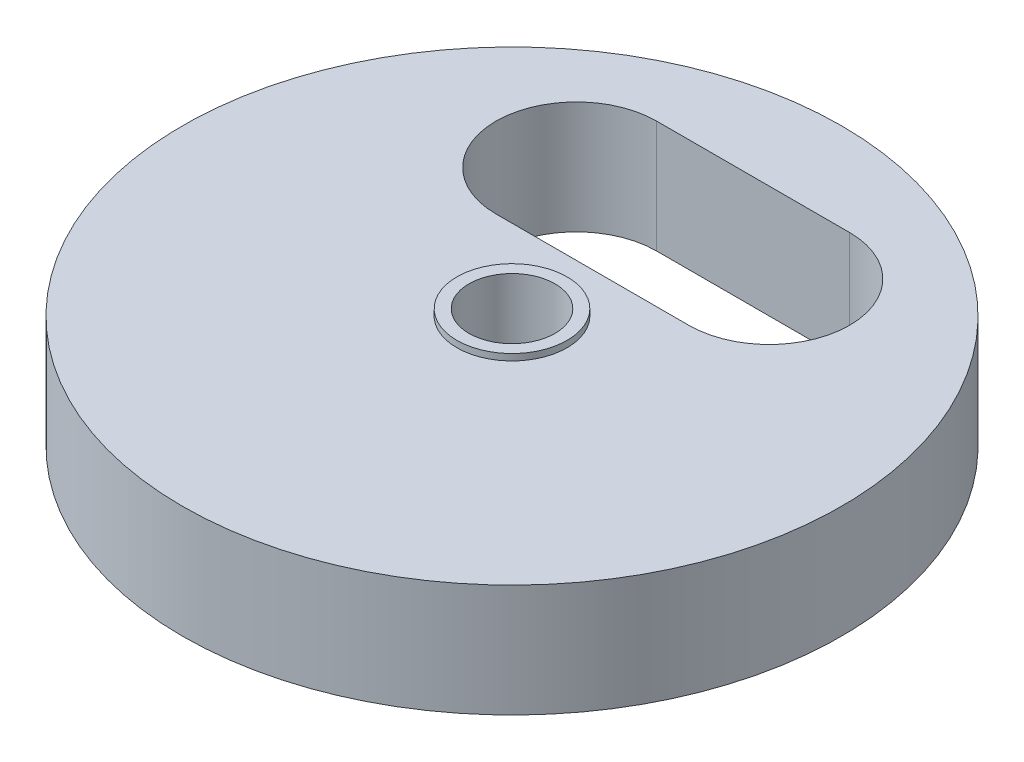
ISO-10303-21;
HEADER;
FILE_DESCRIPTION(('STEP AP214'),'2;1');
FILE_NAME('part.step','',(''),(''),'','','');
FILE_SCHEMA(('AUTOMOTIVE_DESIGN { 1 0 10303 214 1 1 1 1 }'));
ENDSEC;
DATA;
#1=APPLICATION_CONTEXT('core data for automotive mechanical design processes');
#2=APPLICATION_PROTOCOL_DEFINITION('international standard','automotive_design',2000,#1);
#3=PRODUCT_CONTEXT('',#1,'mechanical');
#4=PRODUCT('Part','Part','',(#3));
#5=PRODUCT_RELATED_PRODUCT_CATEGORY('part','',(#4));
#6=PRODUCT_DEFINITION_FORMATION('','',#4);
#7=PRODUCT_DEFINITION_CONTEXT('part definition',#1,'design');
#8=PRODUCT_DEFINITION('design','',#6,#7);
#9=PRODUCT_DEFINITION_SHAPE('','',#8);
#10=(LENGTH_UNIT() NAMED_UNIT(*) SI_UNIT(.MILLI.,.METRE.));
#11=(NAMED_UNIT(*) PLANE_ANGLE_UNIT() SI_UNIT($,.RADIAN.));
#12=(NAMED_UNIT(*) SI_UNIT($,.STERADIAN.) SOLID_ANGLE_UNIT());
#13=UNCERTAINTY_MEASURE_WITH_UNIT(LENGTH_MEASURE(1.E-05),#10,'distance_accuracy_value','');
#14=(GEOMETRIC_REPRESENTATION_CONTEXT(3) GLOBAL_UNCERTAINTY_ASSIGNED_CONTEXT((#13)) GLOBAL_UNIT_ASSIGNED_CONTEXT((#10,
#11,#12)) REPRESENTATION_CONTEXT('',''));
#15=CARTESIAN_POINT('',(0.,0.,0.));
#16=DIRECTION('',(0.,0.,1.));
#17=DIRECTION('',(1.,0.,0.));
#18=AXIS2_PLACEMENT_3D('',#15,#16,#17);
#19=CARTESIAN_POINT('',(0.,7.,0.));
#20=DIRECTION('',(0.,1.,0.));
#21=DIRECTION('',(0.,0.,1.));
#22=AXIS2_PLACEMENT_3D('',#19,#20,#21);
#23=PLANE('',#22);
#24=CARTESIAN_POINT('',(-6.,7.,-10.));
#25=DIRECTION('',(0.,1.,0.));
#26=DIRECTION('',(0.,0.,1.));
#27=AXIS2_PLACEMENT_3D('',#24,#25,#26);
#28=CIRCLE('',#27,5.);
#29=CARTESIAN_POINT('',(-6.,7.,-15.));
#30=VERTEX_POINT('',#29);
#31=CARTESIAN_POINT('',(-6.,7.,-5.));
#32=VERTEX_POINT('',#31);
#33=EDGE_CURVE('E55',#30,#32,#28,.T.);
#34=ORIENTED_EDGE('',*,*,#33,.F.);
#35=DIRECTION('',(-1.,0.,0.));
#36=VECTOR('',#35,1.);
#37=CARTESIAN_POINT('',(-6.,7.,-15.));
#38=LINE('',#37,#36);
#39=CARTESIAN_POINT('',(6.,7.,-15.));
#40=VERTEX_POINT('',#39);
#41=EDGE_CURVE('E102',#40,#30,#38,.T.);
#42=ORIENTED_EDGE('',*,*,#41,.F.);
#43=CARTESIAN_POINT('',(6.,7.,-10.));
#44=DIRECTION('',(0.,1.,0.));
#45=DIRECTION('',(0.,0.,1.));
#46=AXIS2_PLACEMENT_3D('',#43,#44,#45);
#47=CIRCLE('',#46,5.);
#48=CARTESIAN_POINT('',(6.,7.,-5.));
#49=VERTEX_POINT('',#48);
#50=EDGE_CURVE('E106',#49,#40,#47,.T.);
#51=ORIENTED_EDGE('',*,*,#50,.F.);
#52=DIRECTION('',(1.,0.,0.));
#53=VECTOR('',#52,1.);
#54=CARTESIAN_POINT('',(-6.,7.,-5.));
#55=LINE('',#54,#53);
#56=EDGE_CURVE('E115',#32,#49,#55,.T.);
#57=ORIENTED_EDGE('',*,*,#56,.F.);
#58=EDGE_LOOP('',(#34,#42,#51,#57));
#59=FACE_BOUND('',#58,.T.);
#60=CARTESIAN_POINT('',(0.,7.,0.));
#61=DIRECTION('',(0.,1.,0.));
#62=DIRECTION('',(0.,0.,1.));
#63=AXIS2_PLACEMENT_3D('',#60,#61,#62);
#64=CIRCLE('',#63,20.5);
#65=CARTESIAN_POINT('',(0.,7.,20.5));
#66=VERTEX_POINT('',#65);
#67=EDGE_CURVE('E11',#66,#66,#64,.T.);
#68=ORIENTED_EDGE('',*,*,#67,.T.);
#69=EDGE_LOOP('',(#68));
#70=FACE_BOUND('',#69,.T.);
#71=CARTESIAN_POINT('',(0.,7.,0.));
#72=DIRECTION('',(0.,1.,0.));
#73=DIRECTION('',(0.,0.,1.));
#74=AXIS2_PLACEMENT_3D('',#71,#72,#73);
#75=CIRCLE('',#74,3.425);
#76=CARTESIAN_POINT('',(0.,7.,3.425));
#77=VERTEX_POINT('',#76);
#78=EDGE_CURVE('E133',#77,#77,#75,.T.);
#79=ORIENTED_EDGE('',*,*,#78,.F.);
#80=EDGE_LOOP('',(#79));
#81=FACE_BOUND('',#80,.T.);
#82=ADVANCED_FACE('F39',(#59,#70,#81),#23,.T.);
#83=CARTESIAN_POINT('',(0.,7.,0.));
#84=DIRECTION('',(0.,-1.,0.));
#85=DIRECTION('',(0.,0.,-1.));
#86=AXIS2_PLACEMENT_3D('',#83,#84,#85);
#87=CYLINDRICAL_SURFACE('',#86,20.5);
#88=ORIENTED_EDGE('',*,*,#67,.F.);
#89=EDGE_LOOP('',(#88));
#90=FACE_BOUND('',#89,.T.);
#91=CARTESIAN_POINT('',(0.,0.,0.));
#92=DIRECTION('',(0.,1.,0.));
#93=DIRECTION('',(0.,0.,1.));
#94=AXIS2_PLACEMENT_3D('',#91,#92,#93);
#95=CIRCLE('',#94,20.5);
#96=CARTESIAN_POINT('',(0.,0.,20.5));
#97=VERTEX_POINT('',#96);
#98=EDGE_CURVE('E43',#97,#97,#95,.T.);
#99=ORIENTED_EDGE('',*,*,#98,.T.);
#100=EDGE_LOOP('',(#99));
#101=FACE_BOUND('',#100,.T.);
#102=ADVANCED_FACE('F41',(#90,#101),#87,.T.);
#103=CARTESIAN_POINT('',(0.,0.,0.));
#104=DIRECTION('',(0.,1.,0.));
#105=DIRECTION('',(0.,0.,1.));
#106=AXIS2_PLACEMENT_3D('',#103,#104,#105);
#107=PLANE('',#106);
#108=DIRECTION('',(-1.,0.,0.));
#109=VECTOR('',#108,1.);
#110=CARTESIAN_POINT('',(-6.,0.,-15.));
#111=LINE('',#110,#109);
#112=CARTESIAN_POINT('',(6.,0.,-15.));
#113=VERTEX_POINT('',#112);
#114=CARTESIAN_POINT('',(-6.,0.,-15.));
#115=VERTEX_POINT('',#114);
#116=EDGE_CURVE('E90',#113,#115,#111,.T.);
#117=ORIENTED_EDGE('',*,*,#116,.T.);
#118=CARTESIAN_POINT('',(-6.,0.,-10.));
#119=DIRECTION('',(0.,1.,0.));
#120=DIRECTION('',(0.,0.,1.));
#121=AXIS2_PLACEMENT_3D('',#118,#119,#120);
#122=CIRCLE('',#121,5.);
#123=CARTESIAN_POINT('',(-6.,0.,-5.));
#124=VERTEX_POINT('',#123);
#125=EDGE_CURVE('E83',#115,#124,#122,.T.);
#126=ORIENTED_EDGE('',*,*,#125,.T.);
#127=DIRECTION('',(1.,0.,0.));
#128=VECTOR('',#127,1.);
#129=CARTESIAN_POINT('',(-6.,0.,-5.));
#130=LINE('',#129,#128);
#131=CARTESIAN_POINT('',(6.,0.,-5.));
#132=VERTEX_POINT('',#131);
#133=EDGE_CURVE('E93',#124,#132,#130,.T.);
#134=ORIENTED_EDGE('',*,*,#133,.T.);
#135=CARTESIAN_POINT('',(6.,0.,-10.));
#136=DIRECTION('',(0.,1.,0.));
#137=DIRECTION('',(0.,0.,1.));
#138=AXIS2_PLACEMENT_3D('',#135,#136,#137);
#139=CIRCLE('',#138,5.);
#140=EDGE_CURVE('E63',#132,#113,#139,.T.);
#141=ORIENTED_EDGE('',*,*,#140,.T.);
#142=EDGE_LOOP('',(#117,#126,#134,#141));
#143=FACE_BOUND('',#142,.T.);
#144=CARTESIAN_POINT('',(0.,0.,0.));
#145=DIRECTION('',(0.,1.,0.));
#146=DIRECTION('',(0.,0.,1.));
#147=AXIS2_PLACEMENT_3D('',#144,#145,#146);
#148=CIRCLE('',#147,2.675);
#149=CARTESIAN_POINT('',(0.,0.,2.675));
#150=VERTEX_POINT('',#149);
#151=EDGE_CURVE('E138',#150,#150,#148,.T.);
#152=ORIENTED_EDGE('',*,*,#151,.T.);
#153=EDGE_LOOP('',(#152));
#154=FACE_BOUND('',#153,.T.);
#155=ORIENTED_EDGE('',*,*,#98,.F.);
#156=EDGE_LOOP('',(#155));
#157=FACE_BOUND('',#156,.T.);
#158=ADVANCED_FACE('F98',(#143,#154,#157),#107,.F.);
#159=CARTESIAN_POINT('',(0.,0.,0.));
#160=DIRECTION('',(0.,1.,0.));
#161=DIRECTION('',(0.,0.,1.));
#162=AXIS2_PLACEMENT_3D('',#159,#160,#161);
#163=CYLINDRICAL_SURFACE('',#162,2.675);
#164=ORIENTED_EDGE('',*,*,#151,.F.);
#165=EDGE_LOOP('',(#164));
#166=FACE_BOUND('',#165,.T.);
#167=CARTESIAN_POINT('',(0.,7.4,0.));
#168=DIRECTION('',(0.,1.,0.));
#169=DIRECTION('',(0.,0.,1.));
#170=AXIS2_PLACEMENT_3D('',#167,#168,#169);
#171=CIRCLE('',#170,2.675);
#172=CARTESIAN_POINT('',(0.,7.4,2.675));
#173=VERTEX_POINT('',#172);
#174=EDGE_CURVE('E124',#173,#173,#171,.T.);
#175=ORIENTED_EDGE('',*,*,#174,.T.);
#176=EDGE_LOOP('',(#175));
#177=FACE_BOUND('',#176,.T.);
#178=ADVANCED_FACE('F151',(#166,#177),#163,.F.);
#179=CARTESIAN_POINT('',(0.,7.4,0.));
#180=DIRECTION('',(0.,1.,0.));
#181=DIRECTION('',(0.,0.,1.));
#182=AXIS2_PLACEMENT_3D('',#179,#180,#181);
#183=PLANE('',#182);
#184=CARTESIAN_POINT('',(0.,7.4,0.));
#185=DIRECTION('',(0.,1.,0.));
#186=DIRECTION('',(0.,0.,1.));
#187=AXIS2_PLACEMENT_3D('',#184,#185,#186);
#188=CIRCLE('',#187,3.425);
#189=CARTESIAN_POINT('',(0.,7.4,3.425));
#190=VERTEX_POINT('',#189);
#191=EDGE_CURVE('E134',#190,#190,#188,.T.);
#192=ORIENTED_EDGE('',*,*,#191,.T.);
#193=EDGE_LOOP('',(#192));
#194=FACE_BOUND('',#193,.T.);
#195=ORIENTED_EDGE('',*,*,#174,.F.);
#196=EDGE_LOOP('',(#195));
#197=FACE_BOUND('',#196,.T.);
#198=ADVANCED_FACE('F156',(#194,#197),#183,.T.);
#199=CARTESIAN_POINT('',(0.,7.4,0.));
#200=DIRECTION('',(0.,-1.,0.));
#201=DIRECTION('',(0.,0.,-1.));
#202=AXIS2_PLACEMENT_3D('',#199,#200,#201);
#203=CYLINDRICAL_SURFACE('',#202,3.425);
#204=ORIENTED_EDGE('',*,*,#191,.F.);
#205=EDGE_LOOP('',(#204));
#206=FACE_BOUND('',#205,.T.);
#207=ORIENTED_EDGE('',*,*,#78,.T.);
#208=EDGE_LOOP('',(#207));
#209=FACE_BOUND('',#208,.T.);
#210=ADVANCED_FACE('F167',(#206,#209),#203,.T.);
#211=CARTESIAN_POINT('',(-6.,0.,-10.));
#212=DIRECTION('',(0.,1.,0.));
#213=DIRECTION('',(0.,0.,1.));
#214=AXIS2_PLACEMENT_3D('',#211,#212,#213);
#215=CYLINDRICAL_SURFACE('',#214,5.);
#216=ORIENTED_EDGE('',*,*,#33,.T.);
#217=DIRECTION('',(0.,1.,0.));
#218=VECTOR('',#217,1.);
#219=CARTESIAN_POINT('',(-6.,0.,-5.));
#220=LINE('',#219,#218);
#221=EDGE_CURVE('E79',#124,#32,#220,.T.);
#222=ORIENTED_EDGE('',*,*,#221,.F.);
#223=ORIENTED_EDGE('',*,*,#125,.F.);
#224=DIRECTION('',(0.,1.,0.));
#225=VECTOR('',#224,1.);
#226=CARTESIAN_POINT('',(-6.,0.,-15.));
#227=LINE('',#226,#225);
#228=EDGE_CURVE('E121',#115,#30,#227,.T.);
#229=ORIENTED_EDGE('',*,*,#228,.T.);
#230=EDGE_LOOP('',(#216,#222,#223,#229));
#231=FACE_BOUND('',#230,.T.);
#232=ADVANCED_FACE('F81',(#231),#215,.F.);
#233=CARTESIAN_POINT('',(-6.,0.,-15.));
#234=DIRECTION('',(0.,0.,-1.));
#235=DIRECTION('',(-1.,0.,0.));
#236=AXIS2_PLACEMENT_3D('',#233,#234,#235);
#237=PLANE('',#236);
#238=ORIENTED_EDGE('',*,*,#41,.T.);
#239=ORIENTED_EDGE('',*,*,#228,.F.);
#240=ORIENTED_EDGE('',*,*,#116,.F.);
#241=DIRECTION('',(0.,1.,0.));
#242=VECTOR('',#241,1.);
#243=CARTESIAN_POINT('',(6.,0.,-15.));
#244=LINE('',#243,#242);
#245=EDGE_CURVE('E125',#113,#40,#244,.T.);
#246=ORIENTED_EDGE('',*,*,#245,.T.);
#247=EDGE_LOOP('',(#238,#239,#240,#246));
#248=FACE_BOUND('',#247,.T.);
#249=ADVANCED_FACE('F176',(#248),#237,.F.);
#250=CARTESIAN_POINT('',(6.,0.,-10.));
#251=DIRECTION('',(0.,1.,0.));
#252=DIRECTION('',(0.,0.,1.));
#253=AXIS2_PLACEMENT_3D('',#250,#251,#252);
#254=CYLINDRICAL_SURFACE('',#253,5.);
#255=ORIENTED_EDGE('',*,*,#50,.T.);
#256=ORIENTED_EDGE('',*,*,#245,.F.);
#257=ORIENTED_EDGE('',*,*,#140,.F.);
#258=DIRECTION('',(0.,1.,0.));
#259=VECTOR('',#258,1.);
#260=CARTESIAN_POINT('',(6.,0.,-5.));
#261=LINE('',#260,#259);
#262=EDGE_CURVE('E89',#132,#49,#261,.T.);
#263=ORIENTED_EDGE('',*,*,#262,.T.);
#264=EDGE_LOOP('',(#255,#256,#257,#263));
#265=FACE_BOUND('',#264,.T.);
#266=ADVANCED_FACE('F179',(#265),#254,.F.);
#267=CARTESIAN_POINT('',(-6.,0.,-5.));
#268=DIRECTION('',(0.,0.,1.));
#269=DIRECTION('',(1.,0.,0.));
#270=AXIS2_PLACEMENT_3D('',#267,#268,#269);
#271=PLANE('',#270);
#272=ORIENTED_EDGE('',*,*,#56,.T.);
#273=ORIENTED_EDGE('',*,*,#262,.F.);
#274=ORIENTED_EDGE('',*,*,#133,.F.);
#275=ORIENTED_EDGE('',*,*,#221,.T.);
#276=EDGE_LOOP('',(#272,#273,#274,#275));
#277=FACE_BOUND('',#276,.T.);
#278=ADVANCED_FACE('F94',(#277),#271,.F.);
#279=CLOSED_SHELL('',(#82,#102,#158,#178,#198,#210,#232,#249,#266,#278));
#280=MANIFOLD_SOLID_BREP('B2',#279);
#281=ADVANCED_BREP_SHAPE_REPRESENTATION('',(#18,#280),#14);
#282=SHAPE_DEFINITION_REPRESENTATION(#9,#281);
ENDSEC;
END-ISO-10303-21;
